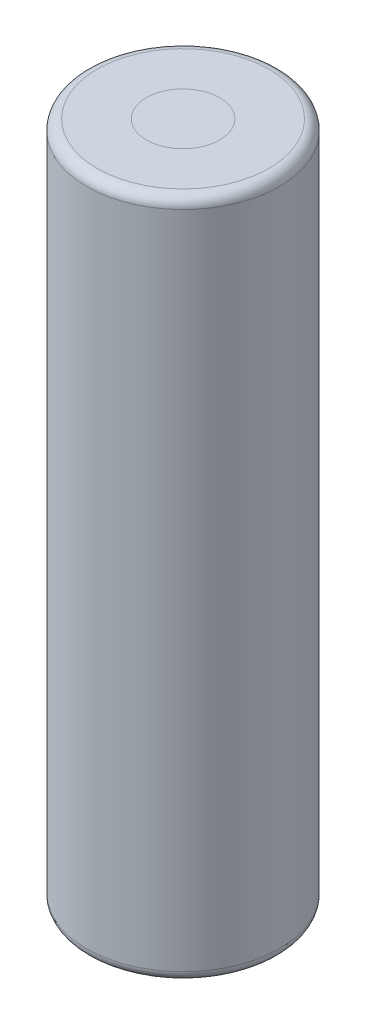
ISO-10303-21;
HEADER;
FILE_DESCRIPTION(('STEP AP214'),'2;1');
FILE_NAME('part.step','',(''),(''),'','','');
FILE_SCHEMA(('AUTOMOTIVE_DESIGN { 1 0 10303 214 1 1 1 1 }'));
ENDSEC;
DATA;
#1=APPLICATION_CONTEXT('core data for automotive mechanical design processes');
#2=APPLICATION_PROTOCOL_DEFINITION('international standard','automotive_design',2000,#1);
#3=PRODUCT_CONTEXT('',#1,'mechanical');
#4=PRODUCT('Part','Part','',(#3));
#5=PRODUCT_RELATED_PRODUCT_CATEGORY('part','',(#4));
#6=PRODUCT_DEFINITION_FORMATION('','',#4);
#7=PRODUCT_DEFINITION_CONTEXT('part definition',#1,'design');
#8=PRODUCT_DEFINITION('design','',#6,#7);
#9=PRODUCT_DEFINITION_SHAPE('','',#8);
#10=(LENGTH_UNIT() NAMED_UNIT(*) SI_UNIT(.MILLI.,.METRE.));
#11=(NAMED_UNIT(*) PLANE_ANGLE_UNIT() SI_UNIT($,.RADIAN.));
#12=(NAMED_UNIT(*) SI_UNIT($,.STERADIAN.) SOLID_ANGLE_UNIT());
#13=UNCERTAINTY_MEASURE_WITH_UNIT(LENGTH_MEASURE(1.E-05),#10,'distance_accuracy_value','');
#14=(GEOMETRIC_REPRESENTATION_CONTEXT(3) GLOBAL_UNCERTAINTY_ASSIGNED_CONTEXT((#13)) GLOBAL_UNIT_ASSIGNED_CONTEXT((#10,
#11,#12)) REPRESENTATION_CONTEXT('',''));
#15=CARTESIAN_POINT('',(0.,0.,0.));
#16=DIRECTION('',(0.,0.,1.));
#17=DIRECTION('',(1.,0.,0.));
#18=AXIS2_PLACEMENT_3D('',#15,#16,#17);
#19=CARTESIAN_POINT('',(0.,32.5,0.));
#20=DIRECTION('',(0.,1.,0.));
#21=DIRECTION('',(0.,0.,1.));
#22=AXIS2_PLACEMENT_3D('',#19,#20,#21);
#23=PLANE('',#22);
#24=CARTESIAN_POINT('',(0.,32.5,0.));
#25=DIRECTION('',(0.,1.,0.));
#26=DIRECTION('',(0.,0.,1.));
#27=AXIS2_PLACEMENT_3D('',#24,#25,#26);
#28=CIRCLE('',#27,8.2);
#29=CARTESIAN_POINT('',(0.,32.5,8.2));
#30=VERTEX_POINT('',#29);
#31=EDGE_CURVE('E45',#30,#30,#28,.T.);
#32=ORIENTED_EDGE('',*,*,#31,.T.);
#33=EDGE_LOOP('',(#32));
#34=FACE_BOUND('',#33,.T.);
#35=CARTESIAN_POINT('',(0.,32.5,0.));
#36=DIRECTION('',(0.,1.,0.));
#37=DIRECTION('',(0.,0.,1.));
#38=AXIS2_PLACEMENT_3D('',#35,#36,#37);
#39=CIRCLE('',#38,3.5);
#40=CARTESIAN_POINT('',(0.,32.5,3.5));
#41=VERTEX_POINT('',#40);
#42=EDGE_CURVE('E10',#41,#41,#39,.F.);
#43=ORIENTED_EDGE('',*,*,#42,.T.);
#44=EDGE_LOOP('',(#43));
#45=FACE_BOUND('',#44,.T.);
#46=ADVANCED_FACE('F37',(#34,#45),#23,.T.);
#47=CARTESIAN_POINT('',(0.,32.5,0.));
#48=DIRECTION('',(0.,-1.,0.));
#49=DIRECTION('',(0.,0.,-1.));
#50=AXIS2_PLACEMENT_3D('',#47,#48,#49);
#51=CYLINDRICAL_SURFACE('',#50,9.2);
#52=CARTESIAN_POINT('',(0.,-31.5,0.));
#53=DIRECTION('',(0.,1.,0.));
#54=DIRECTION('',(0.,0.,1.));
#55=AXIS2_PLACEMENT_3D('',#52,#53,#54);
#56=CIRCLE('',#55,9.2);
#57=CARTESIAN_POINT('',(0.,-31.5,9.2));
#58=VERTEX_POINT('',#57);
#59=EDGE_CURVE('E55',#58,#58,#56,.T.);
#60=ORIENTED_EDGE('',*,*,#59,.T.);
#61=EDGE_LOOP('',(#60));
#62=FACE_BOUND('',#61,.T.);
#63=CARTESIAN_POINT('',(0.,31.5,0.));
#64=DIRECTION('',(0.,1.,0.));
#65=DIRECTION('',(0.,0.,1.));
#66=AXIS2_PLACEMENT_3D('',#63,#64,#65);
#67=CIRCLE('',#66,9.2);
#68=CARTESIAN_POINT('',(0.,31.5,9.2));
#69=VERTEX_POINT('',#68);
#70=EDGE_CURVE('E60',#69,#69,#67,.F.);
#71=ORIENTED_EDGE('',*,*,#70,.T.);
#72=EDGE_LOOP('',(#71));
#73=FACE_BOUND('',#72,.T.);
#74=ADVANCED_FACE('F64',(#62,#73),#51,.T.);
#75=ORIENTED_EDGE('',*,*,#42,.F.);
#76=EDGE_LOOP('',(#75));
#77=FACE_BOUND('',#76,.T.);
#78=ADVANCED_FACE('F76',(#77),#23,.T.);
#79=CARTESIAN_POINT('',(0.,-32.5,0.));
#80=DIRECTION('',(0.,1.,0.));
#81=DIRECTION('',(0.,0.,1.));
#82=AXIS2_PLACEMENT_3D('',#79,#80,#81);
#83=PLANE('',#82);
#84=CARTESIAN_POINT('',(0.,-32.5,0.));
#85=DIRECTION('',(0.,1.,0.));
#86=DIRECTION('',(0.,0.,1.));
#87=AXIS2_PLACEMENT_3D('',#84,#85,#86);
#88=CIRCLE('',#87,8.2);
#89=CARTESIAN_POINT('',(0.,-32.5,8.2));
#90=VERTEX_POINT('',#89);
#91=EDGE_CURVE('E51',#90,#90,#88,.F.);
#92=ORIENTED_EDGE('',*,*,#91,.T.);
#93=EDGE_LOOP('',(#92));
#94=FACE_BOUND('',#93,.T.);
#95=ADVANCED_FACE('F72',(#94),#83,.F.);
#96=CARTESIAN_POINT('',(0.,-31.5,0.));
#97=DIRECTION('',(0.,1.,0.));
#98=DIRECTION('',(0.,0.,1.));
#99=AXIS2_PLACEMENT_3D('',#96,#97,#98);
#100=TOROIDAL_SURFACE('',#99,8.2,1.);
#101=ORIENTED_EDGE('',*,*,#91,.F.);
#102=EDGE_LOOP('',(#101));
#103=FACE_BOUND('',#102,.T.);
#104=ORIENTED_EDGE('',*,*,#59,.F.);
#105=EDGE_LOOP('',(#104));
#106=FACE_BOUND('',#105,.T.);
#107=ADVANCED_FACE('F68',(#103,#106),#100,.T.);
#108=CARTESIAN_POINT('',(0.,31.5,0.));
#109=DIRECTION('',(0.,1.,0.));
#110=DIRECTION('',(0.,0.,1.));
#111=AXIS2_PLACEMENT_3D('',#108,#109,#110);
#112=TOROIDAL_SURFACE('',#111,8.2,1.);
#113=ORIENTED_EDGE('',*,*,#70,.F.);
#114=EDGE_LOOP('',(#113));
#115=FACE_BOUND('',#114,.T.);
#116=ORIENTED_EDGE('',*,*,#31,.F.);
#117=EDGE_LOOP('',(#116));
#118=FACE_BOUND('',#117,.T.);
#119=ADVANCED_FACE('F39',(#115,#118),#112,.T.);
#120=CLOSED_SHELL('',(#46,#74,#78,#95,#107,#119));
#121=MANIFOLD_SOLID_BREP('B2',#120);
#122=ADVANCED_BREP_SHAPE_REPRESENTATION('',(#18,#121),#14);
#123=SHAPE_DEFINITION_REPRESENTATION(#9,#122);
ENDSEC;
END-ISO-10303-21;
